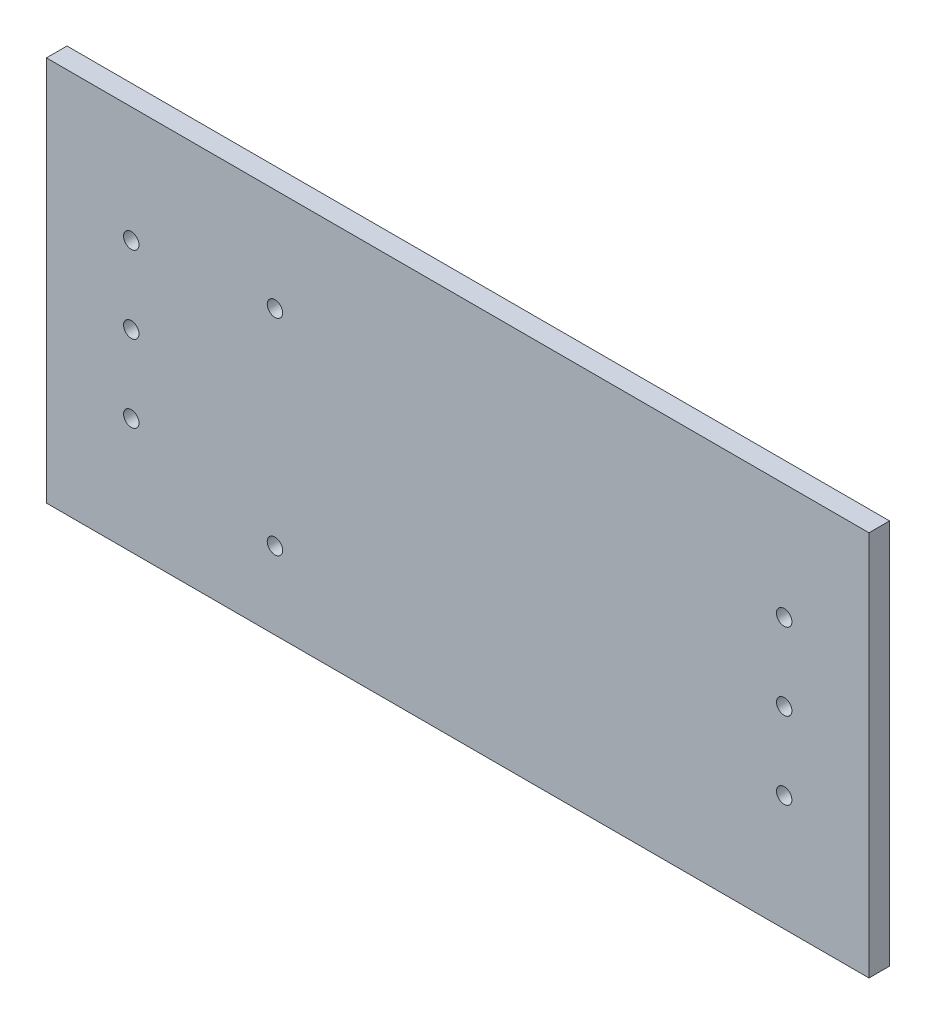
ISO-10303-21;
HEADER;
FILE_DESCRIPTION(('STEP AP214'),'2;1');
FILE_NAME('part.step','',(''),(''),'','','');
FILE_SCHEMA(('AUTOMOTIVE_DESIGN { 1 0 10303 214 1 1 1 1 }'));
ENDSEC;
DATA;
#1=APPLICATION_CONTEXT('core data for automotive mechanical design processes');
#2=APPLICATION_PROTOCOL_DEFINITION('international standard','automotive_design',2000,#1);
#3=PRODUCT_CONTEXT('',#1,'mechanical');
#4=PRODUCT('Part','Part','',(#3));
#5=PRODUCT_RELATED_PRODUCT_CATEGORY('part','',(#4));
#6=PRODUCT_DEFINITION_FORMATION('','',#4);
#7=PRODUCT_DEFINITION_CONTEXT('part definition',#1,'design');
#8=PRODUCT_DEFINITION('design','',#6,#7);
#9=PRODUCT_DEFINITION_SHAPE('','',#8);
#10=(LENGTH_UNIT() NAMED_UNIT(*) SI_UNIT(.MILLI.,.METRE.));
#11=(NAMED_UNIT(*) PLANE_ANGLE_UNIT() SI_UNIT($,.RADIAN.));
#12=(NAMED_UNIT(*) SI_UNIT($,.STERADIAN.) SOLID_ANGLE_UNIT());
#13=UNCERTAINTY_MEASURE_WITH_UNIT(LENGTH_MEASURE(1.E-05),#10,'distance_accuracy_value','');
#14=(GEOMETRIC_REPRESENTATION_CONTEXT(3) GLOBAL_UNCERTAINTY_ASSIGNED_CONTEXT((#13)) GLOBAL_UNIT_ASSIGNED_CONTEXT((#10,
#11,#12)) REPRESENTATION_CONTEXT('',''));
#15=CARTESIAN_POINT('',(0.,0.,0.));
#16=DIRECTION('',(0.,0.,1.));
#17=DIRECTION('',(1.,0.,0.));
#18=AXIS2_PLACEMENT_3D('',#15,#16,#17);
#19=CARTESIAN_POINT('',(0.,0.,4.));
#20=DIRECTION('',(0.,0.,-1.));
#21=DIRECTION('',(-1.,0.,0.));
#22=AXIS2_PLACEMENT_3D('',#19,#20,#21);
#23=PLANE('',#22);
#24=CARTESIAN_POINT('',(44.4468774511435,15.,4.));
#25=DIRECTION('',(0.,0.,1.));
#26=DIRECTION('',(1.,0.,0.));
#27=AXIS2_PLACEMENT_3D('',#24,#25,#26);
#28=CIRCLE('',#27,1.49999999999999);
#29=CARTESIAN_POINT('',(45.9468774511435,15.,4.));
#30=VERTEX_POINT('',#29);
#31=EDGE_CURVE('E243',#30,#30,#28,.T.);
#32=ORIENTED_EDGE('',*,*,#31,.F.);
#33=EDGE_LOOP('',(#32));
#34=FACE_BOUND('',#33,.T.);
#35=CARTESIAN_POINT('',(44.4468774511435,55.,4.));
#36=DIRECTION('',(0.,0.,1.));
#37=DIRECTION('',(1.,0.,0.));
#38=AXIS2_PLACEMENT_3D('',#35,#36,#37);
#39=CIRCLE('',#38,1.49999999999999);
#40=CARTESIAN_POINT('',(45.9468774511435,55.,4.));
#41=VERTEX_POINT('',#40);
#42=EDGE_CURVE('E245',#41,#41,#39,.T.);
#43=ORIENTED_EDGE('',*,*,#42,.F.);
#44=EDGE_LOOP('',(#43));
#45=FACE_BOUND('',#44,.T.);
#46=CARTESIAN_POINT('',(143.5,37.5,4.));
#47=DIRECTION('',(0.,0.,1.));
#48=DIRECTION('',(1.,0.,0.));
#49=AXIS2_PLACEMENT_3D('',#46,#47,#48);
#50=CIRCLE('',#49,1.5);
#51=CARTESIAN_POINT('',(145.,37.5,4.));
#52=VERTEX_POINT('',#51);
#53=EDGE_CURVE('E149',#52,#52,#50,.T.);
#54=ORIENTED_EDGE('',*,*,#53,.F.);
#55=EDGE_LOOP('',(#54));
#56=FACE_BOUND('',#55,.T.);
#57=CARTESIAN_POINT('',(16.5,52.5,4.));
#58=DIRECTION('',(0.,0.,1.));
#59=DIRECTION('',(1.,0.,0.));
#60=AXIS2_PLACEMENT_3D('',#57,#58,#59);
#61=CIRCLE('',#60,1.49999999999999);
#62=CARTESIAN_POINT('',(18.,52.5,4.));
#63=VERTEX_POINT('',#62);
#64=EDGE_CURVE('E166',#63,#63,#61,.T.);
#65=ORIENTED_EDGE('',*,*,#64,.F.);
#66=EDGE_LOOP('',(#65));
#67=FACE_BOUND('',#66,.T.);
#68=CARTESIAN_POINT('',(16.5,22.5,4.));
#69=DIRECTION('',(0.,0.,1.));
#70=DIRECTION('',(1.,0.,0.));
#71=AXIS2_PLACEMENT_3D('',#68,#69,#70);
#72=CIRCLE('',#71,1.49999999999999);
#73=CARTESIAN_POINT('',(18.,22.5,4.));
#74=VERTEX_POINT('',#73);
#75=EDGE_CURVE('E170',#74,#74,#72,.T.);
#76=ORIENTED_EDGE('',*,*,#75,.F.);
#77=EDGE_LOOP('',(#76));
#78=FACE_BOUND('',#77,.T.);
#79=CARTESIAN_POINT('',(143.5,52.5,4.));
#80=DIRECTION('',(0.,0.,1.));
#81=DIRECTION('',(1.,0.,0.));
#82=AXIS2_PLACEMENT_3D('',#79,#80,#81);
#83=CIRCLE('',#82,1.5);
#84=CARTESIAN_POINT('',(145.,52.5,4.));
#85=VERTEX_POINT('',#84);
#86=EDGE_CURVE('E175',#85,#85,#83,.T.);
#87=ORIENTED_EDGE('',*,*,#86,.F.);
#88=EDGE_LOOP('',(#87));
#89=FACE_BOUND('',#88,.T.);
#90=CARTESIAN_POINT('',(143.5,22.5,4.));
#91=DIRECTION('',(0.,0.,1.));
#92=DIRECTION('',(1.,0.,0.));
#93=AXIS2_PLACEMENT_3D('',#90,#91,#92);
#94=CIRCLE('',#93,1.5);
#95=CARTESIAN_POINT('',(145.,22.5,4.));
#96=VERTEX_POINT('',#95);
#97=EDGE_CURVE('E180',#96,#96,#94,.T.);
#98=ORIENTED_EDGE('',*,*,#97,.F.);
#99=EDGE_LOOP('',(#98));
#100=FACE_BOUND('',#99,.T.);
#101=DIRECTION('',(0.,1.,0.));
#102=VECTOR('',#101,1.);
#103=CARTESIAN_POINT('',(0.,0.,4.));
#104=LINE('',#103,#102);
#105=CARTESIAN_POINT('',(0.,0.,4.));
#106=VERTEX_POINT('',#105);
#107=CARTESIAN_POINT('',(0.,75.,4.));
#108=VERTEX_POINT('',#107);
#109=EDGE_CURVE('E98',#106,#108,#104,.T.);
#110=ORIENTED_EDGE('',*,*,#109,.F.);
#111=DIRECTION('',(1.,0.,0.));
#112=VECTOR('',#111,1.);
#113=CARTESIAN_POINT('',(0.,0.,4.));
#114=LINE('',#113,#112);
#115=CARTESIAN_POINT('',(160.,0.,4.));
#116=VERTEX_POINT('',#115);
#117=EDGE_CURVE('E87',#106,#116,#114,.T.);
#118=ORIENTED_EDGE('',*,*,#117,.T.);
#119=DIRECTION('',(0.,1.,0.));
#120=VECTOR('',#119,1.);
#121=CARTESIAN_POINT('',(160.,0.,4.));
#122=LINE('',#121,#120);
#123=CARTESIAN_POINT('',(160.,75.,4.));
#124=VERTEX_POINT('',#123);
#125=EDGE_CURVE('E82',#116,#124,#122,.T.);
#126=ORIENTED_EDGE('',*,*,#125,.T.);
#127=DIRECTION('',(1.,0.,0.));
#128=VECTOR('',#127,1.);
#129=CARTESIAN_POINT('',(0.,75.,4.));
#130=LINE('',#129,#128);
#131=EDGE_CURVE('E86',#108,#124,#130,.T.);
#132=ORIENTED_EDGE('',*,*,#131,.F.);
#133=EDGE_LOOP('',(#110,#118,#126,#132));
#134=FACE_BOUND('',#133,.T.);
#135=CARTESIAN_POINT('',(16.5,37.5,4.));
#136=DIRECTION('',(0.,0.,1.));
#137=DIRECTION('',(1.,0.,0.));
#138=AXIS2_PLACEMENT_3D('',#135,#136,#137);
#139=CIRCLE('',#138,1.49999999999999);
#140=CARTESIAN_POINT('',(18.,37.5,4.));
#141=VERTEX_POINT('',#140);
#142=EDGE_CURVE('E150',#141,#141,#139,.T.);
#143=ORIENTED_EDGE('',*,*,#142,.F.);
#144=EDGE_LOOP('',(#143));
#145=FACE_BOUND('',#144,.T.);
#146=ADVANCED_FACE('F35',(#34,#45,#56,#67,#78,#89,#100,#134,#145),#23,.F.);
#147=CARTESIAN_POINT('',(0.,0.,0.));
#148=DIRECTION('',(0.,0.,-1.));
#149=DIRECTION('',(-1.,0.,0.));
#150=AXIS2_PLACEMENT_3D('',#147,#148,#149);
#151=PLANE('',#150);
#152=CARTESIAN_POINT('',(44.4468774511435,15.,0.));
#153=DIRECTION('',(0.,0.,-1.));
#154=DIRECTION('',(-1.,0.,0.));
#155=AXIS2_PLACEMENT_3D('',#152,#153,#154);
#156=CIRCLE('',#155,1.49999999999999);
#157=CARTESIAN_POINT('',(42.9468774511435,15.,0.));
#158=VERTEX_POINT('',#157);
#159=EDGE_CURVE('E39',#158,#158,#156,.T.);
#160=ORIENTED_EDGE('',*,*,#159,.F.);
#161=EDGE_LOOP('',(#160));
#162=FACE_BOUND('',#161,.T.);
#163=CARTESIAN_POINT('',(44.4468774511435,55.,0.));
#164=DIRECTION('',(0.,0.,-1.));
#165=DIRECTION('',(-1.,0.,0.));
#166=AXIS2_PLACEMENT_3D('',#163,#164,#165);
#167=CIRCLE('',#166,1.49999999999999);
#168=CARTESIAN_POINT('',(42.9468774511435,55.,0.));
#169=VERTEX_POINT('',#168);
#170=EDGE_CURVE('E155',#169,#169,#167,.T.);
#171=ORIENTED_EDGE('',*,*,#170,.F.);
#172=EDGE_LOOP('',(#171));
#173=FACE_BOUND('',#172,.T.);
#174=DIRECTION('',(0.,1.,0.));
#175=VECTOR('',#174,1.);
#176=CARTESIAN_POINT('',(0.,0.,0.));
#177=LINE('',#176,#175);
#178=CARTESIAN_POINT('',(0.,0.,0.));
#179=VERTEX_POINT('',#178);
#180=CARTESIAN_POINT('',(0.,75.,0.));
#181=VERTEX_POINT('',#180);
#182=EDGE_CURVE('E112',#179,#181,#177,.T.);
#183=ORIENTED_EDGE('',*,*,#182,.T.);
#184=DIRECTION('',(1.,0.,0.));
#185=VECTOR('',#184,1.);
#186=CARTESIAN_POINT('',(0.,75.,0.));
#187=LINE('',#186,#185);
#188=CARTESIAN_POINT('',(160.,75.,0.));
#189=VERTEX_POINT('',#188);
#190=EDGE_CURVE('E115',#181,#189,#187,.T.);
#191=ORIENTED_EDGE('',*,*,#190,.T.);
#192=DIRECTION('',(0.,1.,0.));
#193=VECTOR('',#192,1.);
#194=CARTESIAN_POINT('',(160.,0.,0.));
#195=LINE('',#194,#193);
#196=CARTESIAN_POINT('',(160.,0.,0.));
#197=VERTEX_POINT('',#196);
#198=EDGE_CURVE('E94',#197,#189,#195,.T.);
#199=ORIENTED_EDGE('',*,*,#198,.F.);
#200=DIRECTION('',(1.,0.,0.));
#201=VECTOR('',#200,1.);
#202=CARTESIAN_POINT('',(0.,0.,0.));
#203=LINE('',#202,#201);
#204=EDGE_CURVE('E69',#179,#197,#203,.T.);
#205=ORIENTED_EDGE('',*,*,#204,.F.);
#206=EDGE_LOOP('',(#183,#191,#199,#205));
#207=FACE_BOUND('',#206,.T.);
#208=CARTESIAN_POINT('',(143.5,22.5,0.));
#209=DIRECTION('',(0.,0.,1.));
#210=DIRECTION('',(1.,0.,0.));
#211=AXIS2_PLACEMENT_3D('',#208,#209,#210);
#212=CIRCLE('',#211,1.5);
#213=CARTESIAN_POINT('',(145.,22.5,0.));
#214=VERTEX_POINT('',#213);
#215=EDGE_CURVE('E116',#214,#214,#212,.T.);
#216=ORIENTED_EDGE('',*,*,#215,.T.);
#217=EDGE_LOOP('',(#216));
#218=FACE_BOUND('',#217,.T.);
#219=CARTESIAN_POINT('',(143.5,52.5,0.));
#220=DIRECTION('',(0.,0.,1.));
#221=DIRECTION('',(1.,0.,0.));
#222=AXIS2_PLACEMENT_3D('',#219,#220,#221);
#223=CIRCLE('',#222,1.5);
#224=CARTESIAN_POINT('',(145.,52.5,0.));
#225=VERTEX_POINT('',#224);
#226=EDGE_CURVE('E132',#225,#225,#223,.T.);
#227=ORIENTED_EDGE('',*,*,#226,.T.);
#228=EDGE_LOOP('',(#227));
#229=FACE_BOUND('',#228,.T.);
#230=CARTESIAN_POINT('',(16.5,22.5,0.));
#231=DIRECTION('',(0.,0.,1.));
#232=DIRECTION('',(1.,0.,0.));
#233=AXIS2_PLACEMENT_3D('',#230,#231,#232);
#234=CIRCLE('',#233,1.5);
#235=CARTESIAN_POINT('',(18.,22.5,0.));
#236=VERTEX_POINT('',#235);
#237=EDGE_CURVE('E136',#236,#236,#234,.T.);
#238=ORIENTED_EDGE('',*,*,#237,.T.);
#239=EDGE_LOOP('',(#238));
#240=FACE_BOUND('',#239,.T.);
#241=CARTESIAN_POINT('',(16.5,52.5,0.));
#242=DIRECTION('',(0.,0.,1.));
#243=DIRECTION('',(1.,0.,0.));
#244=AXIS2_PLACEMENT_3D('',#241,#242,#243);
#245=CIRCLE('',#244,1.5);
#246=CARTESIAN_POINT('',(18.,52.5,0.));
#247=VERTEX_POINT('',#246);
#248=EDGE_CURVE('E140',#247,#247,#245,.T.);
#249=ORIENTED_EDGE('',*,*,#248,.T.);
#250=EDGE_LOOP('',(#249));
#251=FACE_BOUND('',#250,.T.);
#252=CARTESIAN_POINT('',(143.5,37.5,0.));
#253=DIRECTION('',(0.,0.,1.));
#254=DIRECTION('',(1.,0.,0.));
#255=AXIS2_PLACEMENT_3D('',#252,#253,#254);
#256=CIRCLE('',#255,1.5);
#257=CARTESIAN_POINT('',(145.,37.5,0.));
#258=VERTEX_POINT('',#257);
#259=EDGE_CURVE('E144',#258,#258,#256,.T.);
#260=ORIENTED_EDGE('',*,*,#259,.T.);
#261=EDGE_LOOP('',(#260));
#262=FACE_BOUND('',#261,.T.);
#263=CARTESIAN_POINT('',(16.5,37.5,0.));
#264=DIRECTION('',(0.,0.,1.));
#265=DIRECTION('',(1.,0.,0.));
#266=AXIS2_PLACEMENT_3D('',#263,#264,#265);
#267=CIRCLE('',#266,1.5);
#268=CARTESIAN_POINT('',(18.,37.5,0.));
#269=VERTEX_POINT('',#268);
#270=EDGE_CURVE('E147',#269,#269,#267,.T.);
#271=ORIENTED_EDGE('',*,*,#270,.T.);
#272=EDGE_LOOP('',(#271));
#273=FACE_BOUND('',#272,.T.);
#274=ADVANCED_FACE('F121',(#162,#173,#207,#218,#229,#240,#251,#262,#273),#151,.T.);
#275=CARTESIAN_POINT('',(0.,0.,4.));
#276=DIRECTION('',(-1.,0.,0.));
#277=DIRECTION('',(0.,0.,1.));
#278=AXIS2_PLACEMENT_3D('',#275,#276,#277);
#279=PLANE('',#278);
#280=ORIENTED_EDGE('',*,*,#182,.F.);
#281=DIRECTION('',(0.,0.,-1.));
#282=VECTOR('',#281,1.);
#283=CARTESIAN_POINT('',(0.,0.,4.));
#284=LINE('',#283,#282);
#285=EDGE_CURVE('E12',#106,#179,#284,.T.);
#286=ORIENTED_EDGE('',*,*,#285,.F.);
#287=ORIENTED_EDGE('',*,*,#109,.T.);
#288=DIRECTION('',(0.,0.,-1.));
#289=VECTOR('',#288,1.);
#290=CARTESIAN_POINT('',(0.,75.,4.));
#291=LINE('',#290,#289);
#292=EDGE_CURVE('E77',#108,#181,#291,.T.);
#293=ORIENTED_EDGE('',*,*,#292,.T.);
#294=EDGE_LOOP('',(#280,#286,#287,#293));
#295=FACE_BOUND('',#294,.T.);
#296=ADVANCED_FACE('F37',(#295),#279,.T.);
#297=CARTESIAN_POINT('',(0.,0.,4.));
#298=DIRECTION('',(0.,1.,0.));
#299=DIRECTION('',(0.,0.,1.));
#300=AXIS2_PLACEMENT_3D('',#297,#298,#299);
#301=PLANE('',#300);
#302=ORIENTED_EDGE('',*,*,#204,.T.);
#303=DIRECTION('',(0.,0.,-1.));
#304=VECTOR('',#303,1.);
#305=CARTESIAN_POINT('',(160.,0.,4.));
#306=LINE('',#305,#304);
#307=EDGE_CURVE('E45',#116,#197,#306,.T.);
#308=ORIENTED_EDGE('',*,*,#307,.F.);
#309=ORIENTED_EDGE('',*,*,#117,.F.);
#310=ORIENTED_EDGE('',*,*,#285,.T.);
#311=EDGE_LOOP('',(#302,#308,#309,#310));
#312=FACE_BOUND('',#311,.T.);
#313=ADVANCED_FACE('F197',(#312),#301,.F.);
#314=CARTESIAN_POINT('',(160.,0.,4.));
#315=DIRECTION('',(-1.,0.,0.));
#316=DIRECTION('',(0.,0.,1.));
#317=AXIS2_PLACEMENT_3D('',#314,#315,#316);
#318=PLANE('',#317);
#319=ORIENTED_EDGE('',*,*,#198,.T.);
#320=DIRECTION('',(0.,0.,-1.));
#321=VECTOR('',#320,1.);
#322=CARTESIAN_POINT('',(160.,75.,4.));
#323=LINE('',#322,#321);
#324=EDGE_CURVE('E91',#124,#189,#323,.T.);
#325=ORIENTED_EDGE('',*,*,#324,.F.);
#326=ORIENTED_EDGE('',*,*,#125,.F.);
#327=ORIENTED_EDGE('',*,*,#307,.T.);
#328=EDGE_LOOP('',(#319,#325,#326,#327));
#329=FACE_BOUND('',#328,.T.);
#330=ADVANCED_FACE('F92',(#329),#318,.F.);
#331=CARTESIAN_POINT('',(0.,75.,4.));
#332=DIRECTION('',(0.,1.,0.));
#333=DIRECTION('',(0.,0.,1.));
#334=AXIS2_PLACEMENT_3D('',#331,#332,#333);
#335=PLANE('',#334);
#336=ORIENTED_EDGE('',*,*,#190,.F.);
#337=ORIENTED_EDGE('',*,*,#292,.F.);
#338=ORIENTED_EDGE('',*,*,#131,.T.);
#339=ORIENTED_EDGE('',*,*,#324,.T.);
#340=EDGE_LOOP('',(#336,#337,#338,#339));
#341=FACE_BOUND('',#340,.T.);
#342=ADVANCED_FACE('F97',(#341),#335,.T.);
#343=CARTESIAN_POINT('',(143.5,22.5,4.));
#344=DIRECTION('',(0.,0.,1.));
#345=DIRECTION('',(1.,0.,0.));
#346=AXIS2_PLACEMENT_3D('',#343,#344,#345);
#347=CYLINDRICAL_SURFACE('',#346,1.5);
#348=ORIENTED_EDGE('',*,*,#215,.F.);
#349=EDGE_LOOP('',(#348));
#350=FACE_BOUND('',#349,.T.);
#351=ORIENTED_EDGE('',*,*,#97,.T.);
#352=EDGE_LOOP('',(#351));
#353=FACE_BOUND('',#352,.T.);
#354=ADVANCED_FACE('F185',(#350,#353),#347,.F.);
#355=CARTESIAN_POINT('',(143.5,52.5,4.));
#356=DIRECTION('',(0.,0.,1.));
#357=DIRECTION('',(1.,0.,0.));
#358=AXIS2_PLACEMENT_3D('',#355,#356,#357);
#359=CYLINDRICAL_SURFACE('',#358,1.5);
#360=ORIENTED_EDGE('',*,*,#226,.F.);
#361=EDGE_LOOP('',(#360));
#362=FACE_BOUND('',#361,.T.);
#363=ORIENTED_EDGE('',*,*,#86,.T.);
#364=EDGE_LOOP('',(#363));
#365=FACE_BOUND('',#364,.T.);
#366=ADVANCED_FACE('F205',(#362,#365),#359,.F.);
#367=CARTESIAN_POINT('',(16.5,22.5,4.));
#368=DIRECTION('',(0.,0.,1.));
#369=DIRECTION('',(1.,0.,0.));
#370=AXIS2_PLACEMENT_3D('',#367,#368,#369);
#371=CYLINDRICAL_SURFACE('',#370,1.49999999999999);
#372=ORIENTED_EDGE('',*,*,#237,.F.);
#373=EDGE_LOOP('',(#372));
#374=FACE_BOUND('',#373,.T.);
#375=ORIENTED_EDGE('',*,*,#75,.T.);
#376=EDGE_LOOP('',(#375));
#377=FACE_BOUND('',#376,.T.);
#378=ADVANCED_FACE('F210',(#374,#377),#371,.F.);
#379=CARTESIAN_POINT('',(16.5,52.5,4.));
#380=DIRECTION('',(0.,0.,1.));
#381=DIRECTION('',(1.,0.,0.));
#382=AXIS2_PLACEMENT_3D('',#379,#380,#381);
#383=CYLINDRICAL_SURFACE('',#382,1.49999999999999);
#384=ORIENTED_EDGE('',*,*,#248,.F.);
#385=EDGE_LOOP('',(#384));
#386=FACE_BOUND('',#385,.T.);
#387=ORIENTED_EDGE('',*,*,#64,.T.);
#388=EDGE_LOOP('',(#387));
#389=FACE_BOUND('',#388,.T.);
#390=ADVANCED_FACE('F215',(#386,#389),#383,.F.);
#391=CARTESIAN_POINT('',(143.5,37.5,4.));
#392=DIRECTION('',(0.,0.,1.));
#393=DIRECTION('',(1.,0.,0.));
#394=AXIS2_PLACEMENT_3D('',#391,#392,#393);
#395=CYLINDRICAL_SURFACE('',#394,1.5);
#396=ORIENTED_EDGE('',*,*,#259,.F.);
#397=EDGE_LOOP('',(#396));
#398=FACE_BOUND('',#397,.T.);
#399=ORIENTED_EDGE('',*,*,#53,.T.);
#400=EDGE_LOOP('',(#399));
#401=FACE_BOUND('',#400,.T.);
#402=ADVANCED_FACE('F222',(#398,#401),#395,.F.);
#403=CARTESIAN_POINT('',(16.5,37.5,4.));
#404=DIRECTION('',(0.,0.,1.));
#405=DIRECTION('',(1.,0.,0.));
#406=AXIS2_PLACEMENT_3D('',#403,#404,#405);
#407=CYLINDRICAL_SURFACE('',#406,1.49999999999999);
#408=ORIENTED_EDGE('',*,*,#270,.F.);
#409=EDGE_LOOP('',(#408));
#410=FACE_BOUND('',#409,.T.);
#411=ORIENTED_EDGE('',*,*,#142,.T.);
#412=EDGE_LOOP('',(#411));
#413=FACE_BOUND('',#412,.T.);
#414=ADVANCED_FACE('F226',(#410,#413),#407,.F.);
#415=CARTESIAN_POINT('',(44.4468774511435,55.,4.));
#416=DIRECTION('',(0.,0.,1.));
#417=DIRECTION('',(1.,0.,0.));
#418=AXIS2_PLACEMENT_3D('',#415,#416,#417);
#419=CYLINDRICAL_SURFACE('',#418,1.49999999999999);
#420=ORIENTED_EDGE('',*,*,#170,.T.);
#421=EDGE_LOOP('',(#420));
#422=FACE_BOUND('',#421,.T.);
#423=ORIENTED_EDGE('',*,*,#42,.T.);
#424=EDGE_LOOP('',(#423));
#425=FACE_BOUND('',#424,.T.);
#426=ADVANCED_FACE('F230',(#422,#425),#419,.F.);
#427=CARTESIAN_POINT('',(44.4468774511435,15.,4.));
#428=DIRECTION('',(0.,0.,1.));
#429=DIRECTION('',(1.,0.,0.));
#430=AXIS2_PLACEMENT_3D('',#427,#428,#429);
#431=CYLINDRICAL_SURFACE('',#430,1.49999999999999);
#432=ORIENTED_EDGE('',*,*,#159,.T.);
#433=EDGE_LOOP('',(#432));
#434=FACE_BOUND('',#433,.T.);
#435=ORIENTED_EDGE('',*,*,#31,.T.);
#436=EDGE_LOOP('',(#435));
#437=FACE_BOUND('',#436,.T.);
#438=ADVANCED_FACE('F233',(#434,#437),#431,.F.);
#439=CLOSED_SHELL('',(#146,#274,#296,#313,#330,#342,#354,#366,#378,#390,#402,#414,#426,#438));
#440=MANIFOLD_SOLID_BREP('B2',#439);
#441=ADVANCED_BREP_SHAPE_REPRESENTATION('',(#18,#440),#14);
#442=SHAPE_DEFINITION_REPRESENTATION(#9,#441);
ENDSEC;
END-ISO-10303-21;
